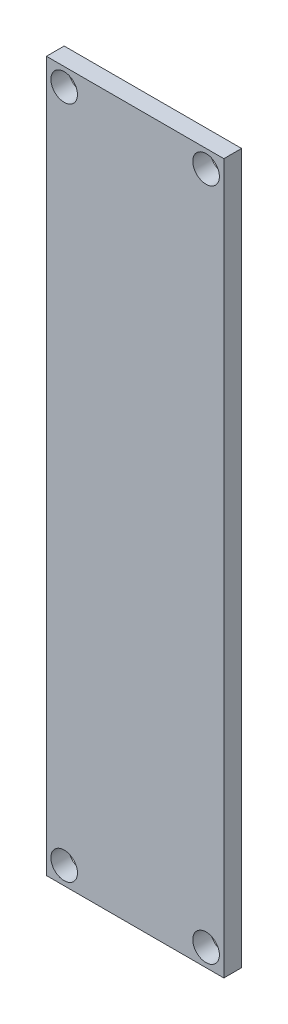
ISO-10303-21;
HEADER;
FILE_DESCRIPTION(('STEP AP214'),'2;1');
FILE_NAME('part.step','',(''),(''),'','','');
FILE_SCHEMA(('AUTOMOTIVE_DESIGN { 1 0 10303 214 1 1 1 1 }'));
ENDSEC;
DATA;
#1=APPLICATION_CONTEXT('core data for automotive mechanical design processes');
#2=APPLICATION_PROTOCOL_DEFINITION('international standard','automotive_design',2000,#1);
#3=PRODUCT_CONTEXT('',#1,'mechanical');
#4=PRODUCT('Part','Part','',(#3));
#5=PRODUCT_RELATED_PRODUCT_CATEGORY('part','',(#4));
#6=PRODUCT_DEFINITION_FORMATION('','',#4);
#7=PRODUCT_DEFINITION_CONTEXT('part definition',#1,'design');
#8=PRODUCT_DEFINITION('design','',#6,#7);
#9=PRODUCT_DEFINITION_SHAPE('','',#8);
#10=(LENGTH_UNIT() NAMED_UNIT(*) SI_UNIT(.MILLI.,.METRE.));
#11=(NAMED_UNIT(*) PLANE_ANGLE_UNIT() SI_UNIT($,.RADIAN.));
#12=(NAMED_UNIT(*) SI_UNIT($,.STERADIAN.) SOLID_ANGLE_UNIT());
#13=UNCERTAINTY_MEASURE_WITH_UNIT(LENGTH_MEASURE(1.E-05),#10,'distance_accuracy_value','');
#14=(GEOMETRIC_REPRESENTATION_CONTEXT(3) GLOBAL_UNCERTAINTY_ASSIGNED_CONTEXT((#13)) GLOBAL_UNIT_ASSIGNED_CONTEXT((#10,
#11,#12)) REPRESENTATION_CONTEXT('',''));
#15=CARTESIAN_POINT('',(0.,0.,0.));
#16=DIRECTION('',(0.,0.,1.));
#17=DIRECTION('',(1.,0.,0.));
#18=AXIS2_PLACEMENT_3D('',#15,#16,#17);
#19=CARTESIAN_POINT('',(31.8074695864331,-23.0628204908956,2.));
#20=DIRECTION('',(1.,0.,0.));
#21=DIRECTION('',(0.,0.,-1.));
#22=AXIS2_PLACEMENT_3D('',#19,#20,#21);
#23=PLANE('',#22);
#24=DIRECTION('',(0.,-1.,0.));
#25=VECTOR('',#24,1.);
#26=CARTESIAN_POINT('',(31.8074695864331,-23.0628204908956,0.));
#27=LINE('',#26,#25);
#28=CARTESIAN_POINT('',(31.8074695864331,-23.0628204908956,0.));
#29=VERTEX_POINT('',#28);
#30=CARTESIAN_POINT('',(31.8074695864331,-103.062820490896,0.));
#31=VERTEX_POINT('',#30);
#32=EDGE_CURVE('E95',#29,#31,#27,.T.);
#33=ORIENTED_EDGE('',*,*,#32,.T.);
#34=DIRECTION('',(0.,0.,-1.));
#35=VECTOR('',#34,1.);
#36=CARTESIAN_POINT('',(31.8074695864331,-103.062820490896,2.));
#37=LINE('',#36,#35);
#38=CARTESIAN_POINT('',(31.8074695864331,-103.062820490896,2.));
#39=VERTEX_POINT('',#38);
#40=EDGE_CURVE('E11',#39,#31,#37,.T.);
#41=ORIENTED_EDGE('',*,*,#40,.F.);
#42=DIRECTION('',(0.,-1.,0.));
#43=VECTOR('',#42,1.);
#44=CARTESIAN_POINT('',(31.8074695864331,-23.0628204908956,2.));
#45=LINE('',#44,#43);
#46=CARTESIAN_POINT('',(31.8074695864331,-23.0628204908956,2.));
#47=VERTEX_POINT('',#46);
#48=EDGE_CURVE('E83',#47,#39,#45,.T.);
#49=ORIENTED_EDGE('',*,*,#48,.F.);
#50=DIRECTION('',(0.,0.,-1.));
#51=VECTOR('',#50,1.);
#52=CARTESIAN_POINT('',(31.8074695864331,-23.0628204908956,2.));
#53=LINE('',#52,#51);
#54=EDGE_CURVE('E91',#47,#29,#53,.T.);
#55=ORIENTED_EDGE('',*,*,#54,.T.);
#56=EDGE_LOOP('',(#33,#41,#49,#55));
#57=FACE_BOUND('',#56,.T.);
#58=ADVANCED_FACE('F32',(#57),#23,.F.);
#59=CARTESIAN_POINT('',(31.8074695864331,-103.062820490896,2.));
#60=DIRECTION('',(0.,1.,0.));
#61=DIRECTION('',(0.,0.,1.));
#62=AXIS2_PLACEMENT_3D('',#59,#60,#61);
#63=PLANE('',#62);
#64=DIRECTION('',(1.,0.,0.));
#65=VECTOR('',#64,1.);
#66=CARTESIAN_POINT('',(31.8074695864331,-103.062820490896,0.));
#67=LINE('',#66,#65);
#68=CARTESIAN_POINT('',(51.8074695864331,-103.062820490896,0.));
#69=VERTEX_POINT('',#68);
#70=EDGE_CURVE('E87',#31,#69,#67,.T.);
#71=ORIENTED_EDGE('',*,*,#70,.T.);
#72=DIRECTION('',(0.,0.,-1.));
#73=VECTOR('',#72,1.);
#74=CARTESIAN_POINT('',(51.8074695864331,-103.062820490896,2.));
#75=LINE('',#74,#73);
#76=CARTESIAN_POINT('',(51.8074695864331,-103.062820490896,2.));
#77=VERTEX_POINT('',#76);
#78=EDGE_CURVE('E40',#77,#69,#75,.T.);
#79=ORIENTED_EDGE('',*,*,#78,.F.);
#80=DIRECTION('',(1.,0.,0.));
#81=VECTOR('',#80,1.);
#82=CARTESIAN_POINT('',(31.8074695864331,-103.062820490896,2.));
#83=LINE('',#82,#81);
#84=EDGE_CURVE('E78',#39,#77,#83,.T.);
#85=ORIENTED_EDGE('',*,*,#84,.F.);
#86=ORIENTED_EDGE('',*,*,#40,.T.);
#87=EDGE_LOOP('',(#71,#79,#85,#86));
#88=FACE_BOUND('',#87,.T.);
#89=ADVANCED_FACE('F86',(#88),#63,.F.);
#90=CARTESIAN_POINT('',(51.8074695864331,-23.0628204908956,2.));
#91=DIRECTION('',(-1.,0.,0.));
#92=DIRECTION('',(0.,-1.,0.));
#93=AXIS2_PLACEMENT_3D('',#90,#91,#92);
#94=PLANE('',#93);
#95=DIRECTION('',(0.,1.,0.));
#96=VECTOR('',#95,1.);
#97=CARTESIAN_POINT('',(51.8074695864331,-23.0628204908956,0.));
#98=LINE('',#97,#96);
#99=CARTESIAN_POINT('',(51.8074695864331,-23.0628204908956,0.));
#100=VERTEX_POINT('',#99);
#101=EDGE_CURVE('E65',#69,#100,#98,.T.);
#102=ORIENTED_EDGE('',*,*,#101,.T.);
#103=DIRECTION('',(0.,0.,-1.));
#104=VECTOR('',#103,1.);
#105=CARTESIAN_POINT('',(51.8074695864331,-23.0628204908956,2.));
#106=LINE('',#105,#104);
#107=CARTESIAN_POINT('',(51.8074695864331,-23.0628204908956,2.));
#108=VERTEX_POINT('',#107);
#109=EDGE_CURVE('E88',#108,#100,#106,.T.);
#110=ORIENTED_EDGE('',*,*,#109,.F.);
#111=DIRECTION('',(0.,1.,0.));
#112=VECTOR('',#111,1.);
#113=CARTESIAN_POINT('',(51.8074695864331,-23.0628204908956,2.));
#114=LINE('',#113,#112);
#115=EDGE_CURVE('E81',#77,#108,#114,.T.);
#116=ORIENTED_EDGE('',*,*,#115,.F.);
#117=ORIENTED_EDGE('',*,*,#78,.T.);
#118=EDGE_LOOP('',(#102,#110,#116,#117));
#119=FACE_BOUND('',#118,.T.);
#120=ADVANCED_FACE('F89',(#119),#94,.F.);
#121=CARTESIAN_POINT('',(31.8074695864331,-23.0628204908956,2.));
#122=DIRECTION('',(0.,-1.,0.));
#123=DIRECTION('',(0.,0.,-1.));
#124=AXIS2_PLACEMENT_3D('',#121,#122,#123);
#125=PLANE('',#124);
#126=DIRECTION('',(-1.,0.,0.));
#127=VECTOR('',#126,1.);
#128=CARTESIAN_POINT('',(31.8074695864331,-23.0628204908956,0.));
#129=LINE('',#128,#127);
#130=EDGE_CURVE('E71',#100,#29,#129,.T.);
#131=ORIENTED_EDGE('',*,*,#130,.T.);
#132=ORIENTED_EDGE('',*,*,#54,.F.);
#133=DIRECTION('',(-1.,0.,0.));
#134=VECTOR('',#133,1.);
#135=CARTESIAN_POINT('',(31.8074695864331,-23.0628204908956,2.));
#136=LINE('',#135,#134);
#137=EDGE_CURVE('E48',#108,#47,#136,.T.);
#138=ORIENTED_EDGE('',*,*,#137,.F.);
#139=ORIENTED_EDGE('',*,*,#109,.T.);
#140=EDGE_LOOP('',(#131,#132,#138,#139));
#141=FACE_BOUND('',#140,.T.);
#142=ADVANCED_FACE('F103',(#141),#125,.F.);
#143=CARTESIAN_POINT('',(0.,0.,2.));
#144=DIRECTION('',(0.,0.,1.));
#145=DIRECTION('',(1.,0.,0.));
#146=AXIS2_PLACEMENT_3D('',#143,#144,#145);
#147=PLANE('',#146);
#148=CARTESIAN_POINT('',(49.8074695864331,-25.0628204908956,2.));
#149=DIRECTION('',(0.,0.,1.));
#150=DIRECTION('',(-1.,0.,0.));
#151=AXIS2_PLACEMENT_3D('',#148,#149,#150);
#152=CIRCLE('',#151,1.5);
#153=CARTESIAN_POINT('',(48.3074695864331,-25.0628204908956,2.));
#154=VERTEX_POINT('',#153);
#155=EDGE_CURVE('E122',#154,#154,#152,.T.);
#156=ORIENTED_EDGE('',*,*,#155,.F.);
#157=EDGE_LOOP('',(#156));
#158=FACE_BOUND('',#157,.T.);
#159=CARTESIAN_POINT('',(33.8074695864331,-101.062820490896,2.));
#160=DIRECTION('',(0.,0.,1.));
#161=DIRECTION('',(-1.,0.,0.));
#162=AXIS2_PLACEMENT_3D('',#159,#160,#161);
#163=CIRCLE('',#162,1.5);
#164=CARTESIAN_POINT('',(32.3074695864331,-101.062820490896,2.));
#165=VERTEX_POINT('',#164);
#166=EDGE_CURVE('E115',#165,#165,#163,.T.);
#167=ORIENTED_EDGE('',*,*,#166,.F.);
#168=EDGE_LOOP('',(#167));
#169=FACE_BOUND('',#168,.T.);
#170=CARTESIAN_POINT('',(49.8074695864331,-101.062820490896,2.));
#171=DIRECTION('',(0.,0.,1.));
#172=DIRECTION('',(1.,0.,0.));
#173=AXIS2_PLACEMENT_3D('',#170,#171,#172);
#174=CIRCLE('',#173,1.5);
#175=CARTESIAN_POINT('',(51.3074695864331,-101.062820490896,2.));
#176=VERTEX_POINT('',#175);
#177=EDGE_CURVE('E127',#176,#176,#174,.T.);
#178=ORIENTED_EDGE('',*,*,#177,.F.);
#179=EDGE_LOOP('',(#178));
#180=FACE_BOUND('',#179,.T.);
#181=CARTESIAN_POINT('',(33.8074695864331,-25.0628204908956,2.));
#182=DIRECTION('',(0.,0.,1.));
#183=DIRECTION('',(1.,0.,0.));
#184=AXIS2_PLACEMENT_3D('',#181,#182,#183);
#185=CIRCLE('',#184,1.5);
#186=CARTESIAN_POINT('',(35.3074695864331,-25.0628204908956,2.));
#187=VERTEX_POINT('',#186);
#188=EDGE_CURVE('E109',#187,#187,#185,.T.);
#189=ORIENTED_EDGE('',*,*,#188,.F.);
#190=EDGE_LOOP('',(#189));
#191=FACE_BOUND('',#190,.T.);
#192=ORIENTED_EDGE('',*,*,#48,.T.);
#193=ORIENTED_EDGE('',*,*,#84,.T.);
#194=ORIENTED_EDGE('',*,*,#115,.T.);
#195=ORIENTED_EDGE('',*,*,#137,.T.);
#196=EDGE_LOOP('',(#192,#193,#194,#195));
#197=FACE_BOUND('',#196,.T.);
#198=ADVANCED_FACE('F79',(#158,#169,#180,#191,#197),#147,.T.);
#199=CARTESIAN_POINT('',(0.,0.,0.));
#200=DIRECTION('',(0.,0.,1.));
#201=DIRECTION('',(1.,0.,0.));
#202=AXIS2_PLACEMENT_3D('',#199,#200,#201);
#203=PLANE('',#202);
#204=CARTESIAN_POINT('',(49.8074695864331,-25.0628204908956,0.));
#205=DIRECTION('',(0.,0.,1.));
#206=DIRECTION('',(-1.,0.,0.));
#207=AXIS2_PLACEMENT_3D('',#204,#205,#206);
#208=CIRCLE('',#207,1.5);
#209=CARTESIAN_POINT('',(48.3074695864331,-25.0628204908956,0.));
#210=VERTEX_POINT('',#209);
#211=EDGE_CURVE('E112',#210,#210,#208,.T.);
#212=ORIENTED_EDGE('',*,*,#211,.T.);
#213=EDGE_LOOP('',(#212));
#214=FACE_BOUND('',#213,.T.);
#215=CARTESIAN_POINT('',(33.8074695864331,-101.062820490896,0.));
#216=DIRECTION('',(0.,0.,1.));
#217=DIRECTION('',(-1.,0.,0.));
#218=AXIS2_PLACEMENT_3D('',#215,#216,#217);
#219=CIRCLE('',#218,1.5);
#220=CARTESIAN_POINT('',(32.3074695864331,-101.062820490896,0.));
#221=VERTEX_POINT('',#220);
#222=EDGE_CURVE('E118',#221,#221,#219,.T.);
#223=ORIENTED_EDGE('',*,*,#222,.T.);
#224=EDGE_LOOP('',(#223));
#225=FACE_BOUND('',#224,.T.);
#226=CARTESIAN_POINT('',(49.8074695864331,-101.062820490896,0.));
#227=DIRECTION('',(0.,0.,1.));
#228=DIRECTION('',(1.,0.,0.));
#229=AXIS2_PLACEMENT_3D('',#226,#227,#228);
#230=CIRCLE('',#229,1.5);
#231=CARTESIAN_POINT('',(51.3074695864331,-101.062820490896,0.));
#232=VERTEX_POINT('',#231);
#233=EDGE_CURVE('E119',#232,#232,#230,.T.);
#234=ORIENTED_EDGE('',*,*,#233,.T.);
#235=EDGE_LOOP('',(#234));
#236=FACE_BOUND('',#235,.T.);
#237=CARTESIAN_POINT('',(33.8074695864331,-25.0628204908956,0.));
#238=DIRECTION('',(0.,0.,1.));
#239=DIRECTION('',(1.,0.,0.));
#240=AXIS2_PLACEMENT_3D('',#237,#238,#239);
#241=CIRCLE('',#240,1.5);
#242=CARTESIAN_POINT('',(35.3074695864331,-25.0628204908956,0.));
#243=VERTEX_POINT('',#242);
#244=EDGE_CURVE('E98',#243,#243,#241,.T.);
#245=ORIENTED_EDGE('',*,*,#244,.T.);
#246=EDGE_LOOP('',(#245));
#247=FACE_BOUND('',#246,.T.);
#248=ORIENTED_EDGE('',*,*,#32,.F.);
#249=ORIENTED_EDGE('',*,*,#130,.F.);
#250=ORIENTED_EDGE('',*,*,#101,.F.);
#251=ORIENTED_EDGE('',*,*,#70,.F.);
#252=EDGE_LOOP('',(#248,#249,#250,#251));
#253=FACE_BOUND('',#252,.T.);
#254=ADVANCED_FACE('F106',(#214,#225,#236,#247,#253),#203,.F.);
#255=CARTESIAN_POINT('',(33.8074695864331,-25.0628204908956,0.));
#256=DIRECTION('',(0.,0.,1.));
#257=DIRECTION('',(1.,0.,0.));
#258=AXIS2_PLACEMENT_3D('',#255,#256,#257);
#259=CYLINDRICAL_SURFACE('',#258,1.5);
#260=ORIENTED_EDGE('',*,*,#244,.F.);
#261=EDGE_LOOP('',(#260));
#262=FACE_BOUND('',#261,.T.);
#263=ORIENTED_EDGE('',*,*,#188,.T.);
#264=EDGE_LOOP('',(#263));
#265=FACE_BOUND('',#264,.T.);
#266=ADVANCED_FACE('F139',(#262,#265),#259,.F.);
#267=CARTESIAN_POINT('',(49.8074695864331,-101.062820490896,0.));
#268=DIRECTION('',(0.,0.,1.));
#269=DIRECTION('',(1.,0.,0.));
#270=AXIS2_PLACEMENT_3D('',#267,#268,#269);
#271=CYLINDRICAL_SURFACE('',#270,1.5);
#272=ORIENTED_EDGE('',*,*,#233,.F.);
#273=EDGE_LOOP('',(#272));
#274=FACE_BOUND('',#273,.T.);
#275=ORIENTED_EDGE('',*,*,#177,.T.);
#276=EDGE_LOOP('',(#275));
#277=FACE_BOUND('',#276,.T.);
#278=ADVANCED_FACE('F135',(#274,#277),#271,.F.);
#279=CARTESIAN_POINT('',(33.8074695864331,-101.062820490896,0.));
#280=DIRECTION('',(0.,0.,1.));
#281=DIRECTION('',(1.,0.,0.));
#282=AXIS2_PLACEMENT_3D('',#279,#280,#281);
#283=CYLINDRICAL_SURFACE('',#282,1.5);
#284=ORIENTED_EDGE('',*,*,#222,.F.);
#285=EDGE_LOOP('',(#284));
#286=FACE_BOUND('',#285,.T.);
#287=ORIENTED_EDGE('',*,*,#166,.T.);
#288=EDGE_LOOP('',(#287));
#289=FACE_BOUND('',#288,.T.);
#290=ADVANCED_FACE('F138',(#286,#289),#283,.F.);
#291=CARTESIAN_POINT('',(49.8074695864331,-25.0628204908956,0.));
#292=DIRECTION('',(0.,0.,1.));
#293=DIRECTION('',(1.,0.,0.));
#294=AXIS2_PLACEMENT_3D('',#291,#292,#293);
#295=CYLINDRICAL_SURFACE('',#294,1.5);
#296=ORIENTED_EDGE('',*,*,#211,.F.);
#297=EDGE_LOOP('',(#296));
#298=FACE_BOUND('',#297,.T.);
#299=ORIENTED_EDGE('',*,*,#155,.T.);
#300=EDGE_LOOP('',(#299));
#301=FACE_BOUND('',#300,.T.);
#302=ADVANCED_FACE('F202',(#298,#301),#295,.F.);
#303=CLOSED_SHELL('',(#58,#89,#120,#142,#198,#254,#266,#278,#290,#302));
#304=MANIFOLD_SOLID_BREP('B2',#303);
#305=ADVANCED_BREP_SHAPE_REPRESENTATION('',(#18,#304),#14);
#306=SHAPE_DEFINITION_REPRESENTATION(#9,#305);
ENDSEC;
END-ISO-10303-21;
